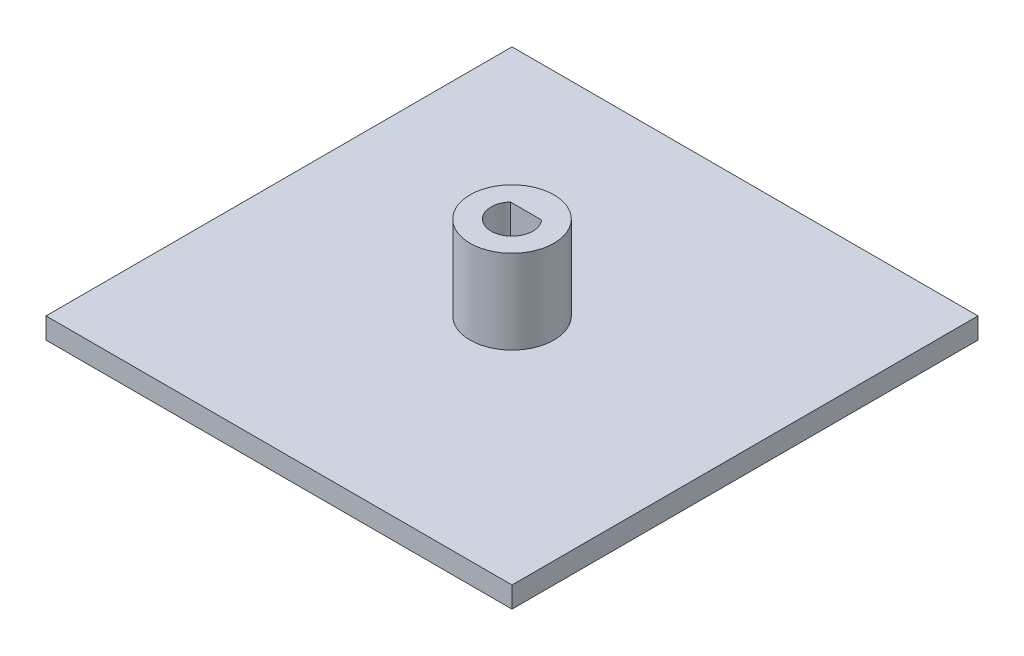
ISO-10303-21;
HEADER;
FILE_DESCRIPTION(('STEP AP214'),'2;1');
FILE_NAME('part.step','',(''),(''),'','','');
FILE_SCHEMA(('AUTOMOTIVE_DESIGN { 1 0 10303 214 1 1 1 1 }'));
ENDSEC;
DATA;
#1=APPLICATION_CONTEXT('core data for automotive mechanical design processes');
#2=APPLICATION_PROTOCOL_DEFINITION('international standard','automotive_design',2000,#1);
#3=PRODUCT_CONTEXT('',#1,'mechanical');
#4=PRODUCT('Part','Part','',(#3));
#5=PRODUCT_RELATED_PRODUCT_CATEGORY('part','',(#4));
#6=PRODUCT_DEFINITION_FORMATION('','',#4);
#7=PRODUCT_DEFINITION_CONTEXT('part definition',#1,'design');
#8=PRODUCT_DEFINITION('design','',#6,#7);
#9=PRODUCT_DEFINITION_SHAPE('','',#8);
#10=(LENGTH_UNIT() NAMED_UNIT(*) SI_UNIT(.MILLI.,.METRE.));
#11=(NAMED_UNIT(*) PLANE_ANGLE_UNIT() SI_UNIT($,.RADIAN.));
#12=(NAMED_UNIT(*) SI_UNIT($,.STERADIAN.) SOLID_ANGLE_UNIT());
#13=UNCERTAINTY_MEASURE_WITH_UNIT(LENGTH_MEASURE(1.E-05),#10,'distance_accuracy_value','');
#14=(GEOMETRIC_REPRESENTATION_CONTEXT(3) GLOBAL_UNCERTAINTY_ASSIGNED_CONTEXT((#13)) GLOBAL_UNIT_ASSIGNED_CONTEXT((#10,
#11,#12)) REPRESENTATION_CONTEXT('',''));
#15=CARTESIAN_POINT('',(0.,0.,0.));
#16=DIRECTION('',(0.,0.,1.));
#17=DIRECTION('',(1.,0.,0.));
#18=AXIS2_PLACEMENT_3D('',#15,#16,#17);
#19=CARTESIAN_POINT('',(16.6666666666667,1.5,-16.6666666666667));
#20=DIRECTION('',(-1.,0.,0.));
#21=DIRECTION('',(0.,0.,1.));
#22=AXIS2_PLACEMENT_3D('',#19,#20,#21);
#23=PLANE('',#22);
#24=DIRECTION('',(0.,0.,-1.));
#25=VECTOR('',#24,1.);
#26=CARTESIAN_POINT('',(16.6666666666667,0.,-16.6666666666667));
#27=LINE('',#26,#25);
#28=CARTESIAN_POINT('',(16.6666666666667,0.,16.6666666666667));
#29=VERTEX_POINT('',#28);
#30=CARTESIAN_POINT('',(16.6666666666667,0.,-16.6666666666667));
#31=VERTEX_POINT('',#30);
#32=EDGE_CURVE('E119',#29,#31,#27,.T.);
#33=ORIENTED_EDGE('',*,*,#32,.T.);
#34=DIRECTION('',(0.,-1.,0.));
#35=VECTOR('',#34,1.);
#36=CARTESIAN_POINT('',(16.6666666666667,1.5,-16.6666666666667));
#37=LINE('',#36,#35);
#38=CARTESIAN_POINT('',(16.6666666666667,1.5,-16.6666666666667));
#39=VERTEX_POINT('',#38);
#40=EDGE_CURVE('E11',#39,#31,#37,.T.);
#41=ORIENTED_EDGE('',*,*,#40,.F.);
#42=DIRECTION('',(0.,0.,-1.));
#43=VECTOR('',#42,1.);
#44=CARTESIAN_POINT('',(16.6666666666667,1.5,-16.6666666666667));
#45=LINE('',#44,#43);
#46=CARTESIAN_POINT('',(16.6666666666667,1.5,16.6666666666667));
#47=VERTEX_POINT('',#46);
#48=EDGE_CURVE('E122',#47,#39,#45,.T.);
#49=ORIENTED_EDGE('',*,*,#48,.F.);
#50=DIRECTION('',(0.,-1.,0.));
#51=VECTOR('',#50,1.);
#52=CARTESIAN_POINT('',(16.6666666666667,1.5,16.6666666666667));
#53=LINE('',#52,#51);
#54=EDGE_CURVE('E128',#47,#29,#53,.T.);
#55=ORIENTED_EDGE('',*,*,#54,.T.);
#56=EDGE_LOOP('',(#33,#41,#49,#55));
#57=FACE_BOUND('',#56,.T.);
#58=ADVANCED_FACE('F34',(#57),#23,.F.);
#59=CARTESIAN_POINT('',(-16.6666666666667,1.5,-16.6666666666667));
#60=DIRECTION('',(0.,0.,1.));
#61=DIRECTION('',(1.,0.,0.));
#62=AXIS2_PLACEMENT_3D('',#59,#60,#61);
#63=PLANE('',#62);
#64=DIRECTION('',(-1.,0.,0.));
#65=VECTOR('',#64,1.);
#66=CARTESIAN_POINT('',(-16.6666666666667,0.,-16.6666666666667));
#67=LINE('',#66,#65);
#68=CARTESIAN_POINT('',(-16.6666666666667,0.,-16.6666666666667));
#69=VERTEX_POINT('',#68);
#70=EDGE_CURVE('E131',#31,#69,#67,.T.);
#71=ORIENTED_EDGE('',*,*,#70,.T.);
#72=DIRECTION('',(0.,-1.,0.));
#73=VECTOR('',#72,1.);
#74=CARTESIAN_POINT('',(-16.6666666666667,1.5,-16.6666666666667));
#75=LINE('',#74,#73);
#76=CARTESIAN_POINT('',(-16.6666666666667,1.5,-16.6666666666667));
#77=VERTEX_POINT('',#76);
#78=EDGE_CURVE('E41',#77,#69,#75,.T.);
#79=ORIENTED_EDGE('',*,*,#78,.F.);
#80=DIRECTION('',(-1.,0.,0.));
#81=VECTOR('',#80,1.);
#82=CARTESIAN_POINT('',(-16.6666666666667,1.5,-16.6666666666667));
#83=LINE('',#82,#81);
#84=EDGE_CURVE('E85',#39,#77,#83,.T.);
#85=ORIENTED_EDGE('',*,*,#84,.F.);
#86=ORIENTED_EDGE('',*,*,#40,.T.);
#87=EDGE_LOOP('',(#71,#79,#85,#86));
#88=FACE_BOUND('',#87,.T.);
#89=ADVANCED_FACE('F160',(#88),#63,.F.);
#90=CARTESIAN_POINT('',(-16.6666666666667,1.5,-16.6666666666667));
#91=DIRECTION('',(1.,0.,0.));
#92=DIRECTION('',(0.,0.,-1.));
#93=AXIS2_PLACEMENT_3D('',#90,#91,#92);
#94=PLANE('',#93);
#95=DIRECTION('',(0.,0.,1.));
#96=VECTOR('',#95,1.);
#97=CARTESIAN_POINT('',(-16.6666666666667,0.,-16.6666666666667));
#98=LINE('',#97,#96);
#99=CARTESIAN_POINT('',(-16.6666666666667,0.,16.6666666666667));
#100=VERTEX_POINT('',#99);
#101=EDGE_CURVE('E133',#69,#100,#98,.T.);
#102=ORIENTED_EDGE('',*,*,#101,.T.);
#103=DIRECTION('',(0.,-1.,0.));
#104=VECTOR('',#103,1.);
#105=CARTESIAN_POINT('',(-16.6666666666667,1.5,16.6666666666667));
#106=LINE('',#105,#104);
#107=CARTESIAN_POINT('',(-16.6666666666667,1.5,16.6666666666667));
#108=VERTEX_POINT('',#107);
#109=EDGE_CURVE('E137',#108,#100,#106,.T.);
#110=ORIENTED_EDGE('',*,*,#109,.F.);
#111=DIRECTION('',(0.,0.,1.));
#112=VECTOR('',#111,1.);
#113=CARTESIAN_POINT('',(-16.6666666666667,1.5,-16.6666666666667));
#114=LINE('',#113,#112);
#115=EDGE_CURVE('E125',#77,#108,#114,.T.);
#116=ORIENTED_EDGE('',*,*,#115,.F.);
#117=ORIENTED_EDGE('',*,*,#78,.T.);
#118=EDGE_LOOP('',(#102,#110,#116,#117));
#119=FACE_BOUND('',#118,.T.);
#120=ADVANCED_FACE('F142',(#119),#94,.F.);
#121=CARTESIAN_POINT('',(-16.6666666666667,1.5,16.6666666666667));
#122=DIRECTION('',(0.,0.,-1.));
#123=DIRECTION('',(-1.,0.,0.));
#124=AXIS2_PLACEMENT_3D('',#121,#122,#123);
#125=PLANE('',#124);
#126=DIRECTION('',(1.,0.,0.));
#127=VECTOR('',#126,1.);
#128=CARTESIAN_POINT('',(-16.6666666666667,0.,16.6666666666667));
#129=LINE('',#128,#127);
#130=EDGE_CURVE('E78',#100,#29,#129,.T.);
#131=ORIENTED_EDGE('',*,*,#130,.T.);
#132=ORIENTED_EDGE('',*,*,#54,.F.);
#133=DIRECTION('',(1.,0.,0.));
#134=VECTOR('',#133,1.);
#135=CARTESIAN_POINT('',(-16.6666666666667,1.5,16.6666666666667));
#136=LINE('',#135,#134);
#137=EDGE_CURVE('E57',#108,#47,#136,.T.);
#138=ORIENTED_EDGE('',*,*,#137,.F.);
#139=ORIENTED_EDGE('',*,*,#109,.T.);
#140=EDGE_LOOP('',(#131,#132,#138,#139));
#141=FACE_BOUND('',#140,.T.);
#142=ADVANCED_FACE('F150',(#141),#125,.F.);
#143=CARTESIAN_POINT('',(0.,1.5,0.));
#144=DIRECTION('',(0.,1.,0.));
#145=DIRECTION('',(0.,0.,1.));
#146=AXIS2_PLACEMENT_3D('',#143,#144,#145);
#147=PLANE('',#146);
#148=CARTESIAN_POINT('',(0.,1.5,0.));
#149=DIRECTION('',(0.,1.,0.));
#150=DIRECTION('',(0.,0.,1.));
#151=AXIS2_PLACEMENT_3D('',#148,#149,#150);
#152=CIRCLE('',#151,3.);
#153=CARTESIAN_POINT('',(0.,1.5,3.));
#154=VERTEX_POINT('',#153);
#155=EDGE_CURVE('E114',#154,#154,#152,.T.);
#156=ORIENTED_EDGE('',*,*,#155,.F.);
#157=EDGE_LOOP('',(#156));
#158=FACE_BOUND('',#157,.T.);
#159=ORIENTED_EDGE('',*,*,#48,.T.);
#160=ORIENTED_EDGE('',*,*,#84,.T.);
#161=ORIENTED_EDGE('',*,*,#115,.T.);
#162=ORIENTED_EDGE('',*,*,#137,.T.);
#163=EDGE_LOOP('',(#159,#160,#161,#162));
#164=FACE_BOUND('',#163,.T.);
#165=ADVANCED_FACE('F152',(#158,#164),#147,.T.);
#166=CARTESIAN_POINT('',(0.,0.,0.));
#167=DIRECTION('',(0.,1.,0.));
#168=DIRECTION('',(0.,0.,1.));
#169=AXIS2_PLACEMENT_3D('',#166,#167,#168);
#170=PLANE('',#169);
#171=ORIENTED_EDGE('',*,*,#32,.F.);
#172=ORIENTED_EDGE('',*,*,#130,.F.);
#173=ORIENTED_EDGE('',*,*,#101,.F.);
#174=ORIENTED_EDGE('',*,*,#70,.F.);
#175=EDGE_LOOP('',(#171,#172,#173,#174));
#176=FACE_BOUND('',#175,.T.);
#177=ADVANCED_FACE('F146',(#176),#170,.F.);
#178=CARTESIAN_POINT('',(0.,7.5,0.));
#179=DIRECTION('',(0.,-1.,0.));
#180=DIRECTION('',(0.,0.,-1.));
#181=AXIS2_PLACEMENT_3D('',#178,#179,#180);
#182=CYLINDRICAL_SURFACE('',#181,3.);
#183=CARTESIAN_POINT('',(0.,7.5,0.));
#184=DIRECTION('',(0.,1.,0.));
#185=DIRECTION('',(0.,0.,1.));
#186=AXIS2_PLACEMENT_3D('',#183,#184,#185);
#187=CIRCLE('',#186,3.);
#188=CARTESIAN_POINT('',(0.,7.5,3.));
#189=VERTEX_POINT('',#188);
#190=EDGE_CURVE('E116',#189,#189,#187,.T.);
#191=ORIENTED_EDGE('',*,*,#190,.F.);
#192=EDGE_LOOP('',(#191));
#193=FACE_BOUND('',#192,.T.);
#194=ORIENTED_EDGE('',*,*,#155,.T.);
#195=EDGE_LOOP('',(#194));
#196=FACE_BOUND('',#195,.T.);
#197=ADVANCED_FACE('F187',(#193,#196),#182,.T.);
#198=CARTESIAN_POINT('',(0.,7.5,0.));
#199=DIRECTION('',(0.,1.,0.));
#200=DIRECTION('',(0.,0.,1.));
#201=AXIS2_PLACEMENT_3D('',#198,#199,#200);
#202=PLANE('',#201);
#203=CARTESIAN_POINT('',(0.,7.5,0.));
#204=DIRECTION('',(0.,1.,0.));
#205=DIRECTION('',(0.,0.,1.));
#206=AXIS2_PLACEMENT_3D('',#203,#204,#205);
#207=CIRCLE('',#206,1.5);
#208=CARTESIAN_POINT('',(-1.11803398874989,7.5,-1.));
#209=VERTEX_POINT('',#208);
#210=CARTESIAN_POINT('',(1.11803398874989,7.5,-1.));
#211=VERTEX_POINT('',#210);
#212=EDGE_CURVE('E48',#209,#211,#207,.T.);
#213=ORIENTED_EDGE('',*,*,#212,.F.);
#214=DIRECTION('',(-1.,0.,0.));
#215=VECTOR('',#214,1.);
#216=CARTESIAN_POINT('',(-1.11803398874989,7.5,-1.));
#217=LINE('',#216,#215);
#218=EDGE_CURVE('E107',#211,#209,#217,.T.);
#219=ORIENTED_EDGE('',*,*,#218,.F.);
#220=EDGE_LOOP('',(#213,#219));
#221=FACE_BOUND('',#220,.T.);
#222=ORIENTED_EDGE('',*,*,#190,.T.);
#223=EDGE_LOOP('',(#222));
#224=FACE_BOUND('',#223,.T.);
#225=ADVANCED_FACE('F200',(#221,#224),#202,.T.);
#226=CARTESIAN_POINT('',(0.,1.5,0.));
#227=DIRECTION('',(0.,1.,0.));
#228=DIRECTION('',(0.,0.,1.));
#229=AXIS2_PLACEMENT_3D('',#226,#227,#228);
#230=CYLINDRICAL_SURFACE('',#229,1.5);
#231=ORIENTED_EDGE('',*,*,#212,.T.);
#232=DIRECTION('',(0.,1.,0.));
#233=VECTOR('',#232,1.);
#234=CARTESIAN_POINT('',(1.11803398874989,1.5,-1.));
#235=LINE('',#234,#233);
#236=CARTESIAN_POINT('',(1.11803398874989,1.5,-1.));
#237=VERTEX_POINT('',#236);
#238=EDGE_CURVE('E93',#237,#211,#235,.T.);
#239=ORIENTED_EDGE('',*,*,#238,.F.);
#240=CARTESIAN_POINT('',(0.,1.5,0.));
#241=DIRECTION('',(0.,1.,0.));
#242=DIRECTION('',(0.,0.,1.));
#243=AXIS2_PLACEMENT_3D('',#240,#241,#242);
#244=CIRCLE('',#243,1.5);
#245=CARTESIAN_POINT('',(-1.11803398874989,1.5,-1.));
#246=VERTEX_POINT('',#245);
#247=EDGE_CURVE('E96',#246,#237,#244,.T.);
#248=ORIENTED_EDGE('',*,*,#247,.F.);
#249=DIRECTION('',(0.,1.,0.));
#250=VECTOR('',#249,1.);
#251=CARTESIAN_POINT('',(-1.11803398874989,1.5,-1.));
#252=LINE('',#251,#250);
#253=EDGE_CURVE('E102',#246,#209,#252,.T.);
#254=ORIENTED_EDGE('',*,*,#253,.T.);
#255=EDGE_LOOP('',(#231,#239,#248,#254));
#256=FACE_BOUND('',#255,.T.);
#257=ADVANCED_FACE('F95',(#256),#230,.F.);
#258=CARTESIAN_POINT('',(-1.11803398874989,1.5,-1.));
#259=DIRECTION('',(0.,0.,-1.));
#260=DIRECTION('',(-1.,0.,0.));
#261=AXIS2_PLACEMENT_3D('',#258,#259,#260);
#262=PLANE('',#261);
#263=ORIENTED_EDGE('',*,*,#218,.T.);
#264=ORIENTED_EDGE('',*,*,#253,.F.);
#265=DIRECTION('',(-1.,0.,0.));
#266=VECTOR('',#265,1.);
#267=CARTESIAN_POINT('',(-1.11803398874989,1.5,-1.));
#268=LINE('',#267,#266);
#269=EDGE_CURVE('E103',#237,#246,#268,.T.);
#270=ORIENTED_EDGE('',*,*,#269,.F.);
#271=ORIENTED_EDGE('',*,*,#238,.T.);
#272=EDGE_LOOP('',(#263,#264,#270,#271));
#273=FACE_BOUND('',#272,.T.);
#274=ADVANCED_FACE('F109',(#273),#262,.F.);
#275=CARTESIAN_POINT('',(0.,1.5,0.));
#276=DIRECTION('',(0.,1.,0.));
#277=DIRECTION('',(0.,0.,1.));
#278=AXIS2_PLACEMENT_3D('',#275,#276,#277);
#279=PLANE('',#278);
#280=ORIENTED_EDGE('',*,*,#247,.T.);
#281=ORIENTED_EDGE('',*,*,#269,.T.);
#282=EDGE_LOOP('',(#280,#281));
#283=FACE_BOUND('',#282,.T.);
#284=ADVANCED_FACE('F106',(#283),#279,.T.);
#285=CLOSED_SHELL('',(#58,#89,#120,#142,#165,#177,#197,#225,#257,#274,#284));
#286=MANIFOLD_SOLID_BREP('B2',#285);
#287=ADVANCED_BREP_SHAPE_REPRESENTATION('',(#18,#286),#14);
#288=SHAPE_DEFINITION_REPRESENTATION(#9,#287);
ENDSEC;
END-ISO-10303-21;
